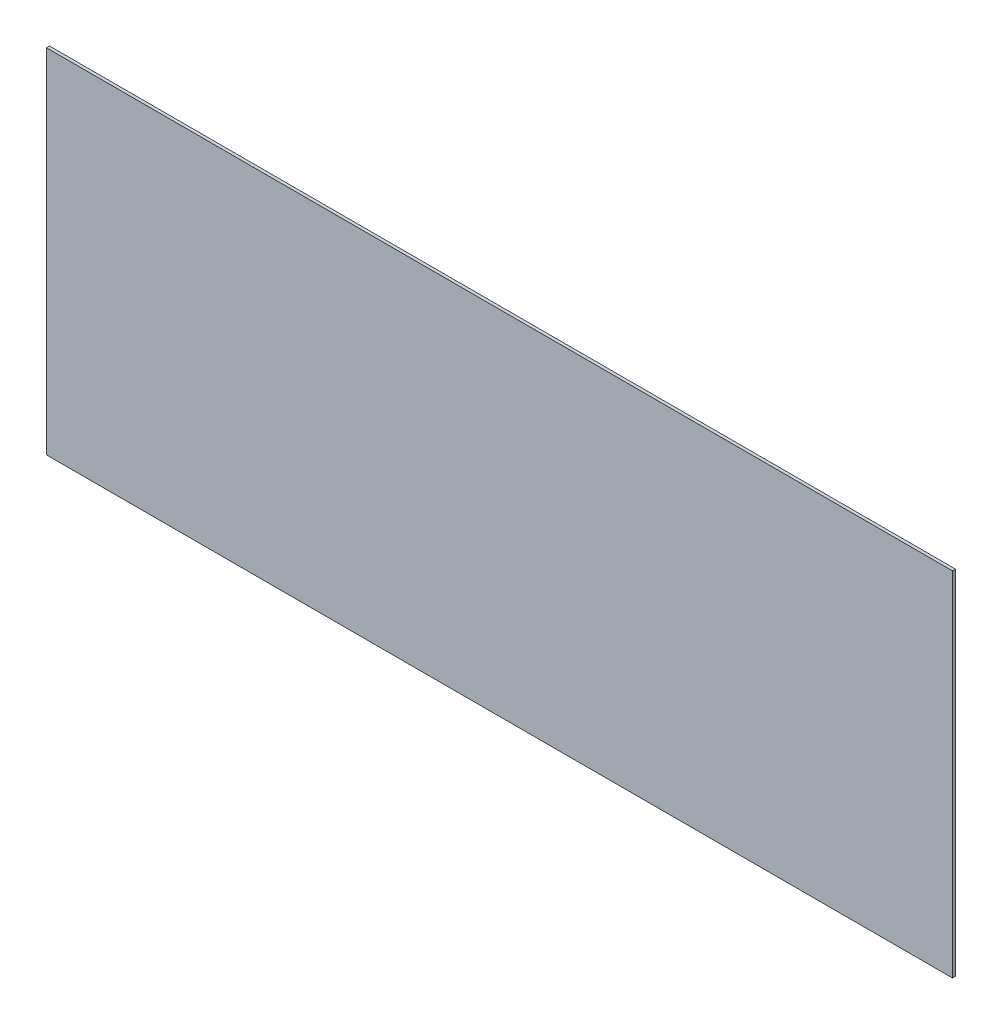
ISO-10303-21;
HEADER;
FILE_DESCRIPTION(('STEP AP214'),'2;1');
FILE_NAME('part.step','',(''),(''),'','','');
FILE_SCHEMA(('AUTOMOTIVE_DESIGN { 1 0 10303 214 1 1 1 1 }'));
ENDSEC;
DATA;
#1=APPLICATION_CONTEXT('core data for automotive mechanical design processes');
#2=APPLICATION_PROTOCOL_DEFINITION('international standard','automotive_design',2000,#1);
#3=PRODUCT_CONTEXT('',#1,'mechanical');
#4=PRODUCT('Part','Part','',(#3));
#5=PRODUCT_RELATED_PRODUCT_CATEGORY('part','',(#4));
#6=PRODUCT_DEFINITION_FORMATION('','',#4);
#7=PRODUCT_DEFINITION_CONTEXT('part definition',#1,'design');
#8=PRODUCT_DEFINITION('design','',#6,#7);
#9=PRODUCT_DEFINITION_SHAPE('','',#8);
#10=(LENGTH_UNIT() NAMED_UNIT(*) SI_UNIT(.MILLI.,.METRE.));
#11=(NAMED_UNIT(*) PLANE_ANGLE_UNIT() SI_UNIT($,.RADIAN.));
#12=(NAMED_UNIT(*) SI_UNIT($,.STERADIAN.) SOLID_ANGLE_UNIT());
#13=UNCERTAINTY_MEASURE_WITH_UNIT(LENGTH_MEASURE(1.E-05),#10,'distance_accuracy_value','');
#14=(GEOMETRIC_REPRESENTATION_CONTEXT(3) GLOBAL_UNCERTAINTY_ASSIGNED_CONTEXT((#13)) GLOBAL_UNIT_ASSIGNED_CONTEXT((#10,
#11,#12)) REPRESENTATION_CONTEXT('',''));
#15=CARTESIAN_POINT('',(0.,0.,0.));
#16=DIRECTION('',(0.,0.,1.));
#17=DIRECTION('',(1.,0.,0.));
#18=AXIS2_PLACEMENT_3D('',#15,#16,#17);
#19=CARTESIAN_POINT('',(474.765,184.765,3.175));
#20=DIRECTION('',(-1.,0.,0.));
#21=DIRECTION('',(0.,0.,1.));
#22=AXIS2_PLACEMENT_3D('',#19,#20,#21);
#23=PLANE('',#22);
#24=DIRECTION('',(0.,1.,0.));
#25=VECTOR('',#24,1.);
#26=CARTESIAN_POINT('',(474.765,184.765,0.));
#27=LINE('',#26,#25);
#28=CARTESIAN_POINT('',(474.765,-184.765,0.));
#29=VERTEX_POINT('',#28);
#30=CARTESIAN_POINT('',(474.765,184.765,0.));
#31=VERTEX_POINT('',#30);
#32=EDGE_CURVE('E104',#29,#31,#27,.T.);
#33=ORIENTED_EDGE('',*,*,#32,.T.);
#34=DIRECTION('',(0.,0.,-1.));
#35=VECTOR('',#34,1.);
#36=CARTESIAN_POINT('',(474.765,184.765,3.175));
#37=LINE('',#36,#35);
#38=CARTESIAN_POINT('',(474.765,184.765,3.175));
#39=VERTEX_POINT('',#38);
#40=EDGE_CURVE('E11',#39,#31,#37,.T.);
#41=ORIENTED_EDGE('',*,*,#40,.F.);
#42=DIRECTION('',(0.,1.,0.));
#43=VECTOR('',#42,1.);
#44=CARTESIAN_POINT('',(474.765,184.765,3.175));
#45=LINE('',#44,#43);
#46=CARTESIAN_POINT('',(474.765,-184.765,3.175));
#47=VERTEX_POINT('',#46);
#48=EDGE_CURVE('E92',#47,#39,#45,.T.);
#49=ORIENTED_EDGE('',*,*,#48,.F.);
#50=DIRECTION('',(0.,0.,-1.));
#51=VECTOR('',#50,1.);
#52=CARTESIAN_POINT('',(474.765,-184.765,3.175));
#53=LINE('',#52,#51);
#54=EDGE_CURVE('E100',#47,#29,#53,.T.);
#55=ORIENTED_EDGE('',*,*,#54,.T.);
#56=EDGE_LOOP('',(#33,#41,#49,#55));
#57=FACE_BOUND('',#56,.T.);
#58=ADVANCED_FACE('F41',(#57),#23,.F.);
#59=CARTESIAN_POINT('',(-474.765,184.765,3.175));
#60=DIRECTION('',(0.,-1.,0.));
#61=DIRECTION('',(0.,0.,-1.));
#62=AXIS2_PLACEMENT_3D('',#59,#60,#61);
#63=PLANE('',#62);
#64=DIRECTION('',(-1.,0.,0.));
#65=VECTOR('',#64,1.);
#66=CARTESIAN_POINT('',(-474.765,184.765,0.));
#67=LINE('',#66,#65);
#68=CARTESIAN_POINT('',(-474.765,184.765,0.));
#69=VERTEX_POINT('',#68);
#70=EDGE_CURVE('E96',#31,#69,#67,.T.);
#71=ORIENTED_EDGE('',*,*,#70,.T.);
#72=DIRECTION('',(0.,0.,-1.));
#73=VECTOR('',#72,1.);
#74=CARTESIAN_POINT('',(-474.765,184.765,3.175));
#75=LINE('',#74,#73);
#76=CARTESIAN_POINT('',(-474.765,184.765,3.175));
#77=VERTEX_POINT('',#76);
#78=EDGE_CURVE('E49',#77,#69,#75,.T.);
#79=ORIENTED_EDGE('',*,*,#78,.F.);
#80=DIRECTION('',(-1.,0.,0.));
#81=VECTOR('',#80,1.);
#82=CARTESIAN_POINT('',(-474.765,184.765,3.175));
#83=LINE('',#82,#81);
#84=EDGE_CURVE('E87',#39,#77,#83,.T.);
#85=ORIENTED_EDGE('',*,*,#84,.F.);
#86=ORIENTED_EDGE('',*,*,#40,.T.);
#87=EDGE_LOOP('',(#71,#79,#85,#86));
#88=FACE_BOUND('',#87,.T.);
#89=ADVANCED_FACE('F95',(#88),#63,.F.);
#90=CARTESIAN_POINT('',(-474.765,184.765,3.175));
#91=DIRECTION('',(1.,0.,0.));
#92=DIRECTION('',(0.,0.,-1.));
#93=AXIS2_PLACEMENT_3D('',#90,#91,#92);
#94=PLANE('',#93);
#95=DIRECTION('',(0.,-1.,0.));
#96=VECTOR('',#95,1.);
#97=CARTESIAN_POINT('',(-474.765,184.765,0.));
#98=LINE('',#97,#96);
#99=CARTESIAN_POINT('',(-474.765,-184.765,0.));
#100=VERTEX_POINT('',#99);
#101=EDGE_CURVE('E74',#69,#100,#98,.T.);
#102=ORIENTED_EDGE('',*,*,#101,.T.);
#103=DIRECTION('',(0.,0.,-1.));
#104=VECTOR('',#103,1.);
#105=CARTESIAN_POINT('',(-474.765,-184.765,3.175));
#106=LINE('',#105,#104);
#107=CARTESIAN_POINT('',(-474.765,-184.765,3.175));
#108=VERTEX_POINT('',#107);
#109=EDGE_CURVE('E97',#108,#100,#106,.T.);
#110=ORIENTED_EDGE('',*,*,#109,.F.);
#111=DIRECTION('',(0.,-1.,0.));
#112=VECTOR('',#111,1.);
#113=CARTESIAN_POINT('',(-474.765,184.765,3.175));
#114=LINE('',#113,#112);
#115=EDGE_CURVE('E90',#77,#108,#114,.T.);
#116=ORIENTED_EDGE('',*,*,#115,.F.);
#117=ORIENTED_EDGE('',*,*,#78,.T.);
#118=EDGE_LOOP('',(#102,#110,#116,#117));
#119=FACE_BOUND('',#118,.T.);
#120=ADVANCED_FACE('F98',(#119),#94,.F.);
#121=CARTESIAN_POINT('',(-474.765,-184.765,3.175));
#122=DIRECTION('',(0.,1.,0.));
#123=DIRECTION('',(0.,0.,1.));
#124=AXIS2_PLACEMENT_3D('',#121,#122,#123);
#125=PLANE('',#124);
#126=DIRECTION('',(1.,0.,0.));
#127=VECTOR('',#126,1.);
#128=CARTESIAN_POINT('',(-474.765,-184.765,0.));
#129=LINE('',#128,#127);
#130=EDGE_CURVE('E80',#100,#29,#129,.T.);
#131=ORIENTED_EDGE('',*,*,#130,.T.);
#132=ORIENTED_EDGE('',*,*,#54,.F.);
#133=DIRECTION('',(1.,0.,0.));
#134=VECTOR('',#133,1.);
#135=CARTESIAN_POINT('',(-474.765,-184.765,3.175));
#136=LINE('',#135,#134);
#137=EDGE_CURVE('E57',#108,#47,#136,.T.);
#138=ORIENTED_EDGE('',*,*,#137,.F.);
#139=ORIENTED_EDGE('',*,*,#109,.T.);
#140=EDGE_LOOP('',(#131,#132,#138,#139));
#141=FACE_BOUND('',#140,.T.);
#142=ADVANCED_FACE('F111',(#141),#125,.F.);
#143=CARTESIAN_POINT('',(0.,0.,3.175));
#144=DIRECTION('',(0.,0.,1.));
#145=DIRECTION('',(1.,0.,0.));
#146=AXIS2_PLACEMENT_3D('',#143,#144,#145);
#147=PLANE('',#146);
#148=ORIENTED_EDGE('',*,*,#48,.T.);
#149=ORIENTED_EDGE('',*,*,#84,.T.);
#150=ORIENTED_EDGE('',*,*,#115,.T.);
#151=ORIENTED_EDGE('',*,*,#137,.T.);
#152=EDGE_LOOP('',(#148,#149,#150,#151));
#153=FACE_BOUND('',#152,.T.);
#154=ADVANCED_FACE('F88',(#153),#147,.T.);
#155=CARTESIAN_POINT('',(0.,0.,0.));
#156=DIRECTION('',(0.,0.,1.));
#157=DIRECTION('',(1.,0.,0.));
#158=AXIS2_PLACEMENT_3D('',#155,#156,#157);
#159=PLANE('',#158);
#160=ORIENTED_EDGE('',*,*,#32,.F.);
#161=ORIENTED_EDGE('',*,*,#130,.F.);
#162=ORIENTED_EDGE('',*,*,#101,.F.);
#163=ORIENTED_EDGE('',*,*,#70,.F.);
#164=EDGE_LOOP('',(#160,#161,#162,#163));
#165=FACE_BOUND('',#164,.T.);
#166=ADVANCED_FACE('F114',(#165),#159,.F.);
#167=CLOSED_SHELL('',(#58,#89,#120,#142,#154,#166));
#168=MANIFOLD_SOLID_BREP('B2',#167);
#169=ADVANCED_BREP_SHAPE_REPRESENTATION('',(#18,#168),#14);
#170=SHAPE_DEFINITION_REPRESENTATION(#9,#169);
ENDSEC;
END-ISO-10303-21;
